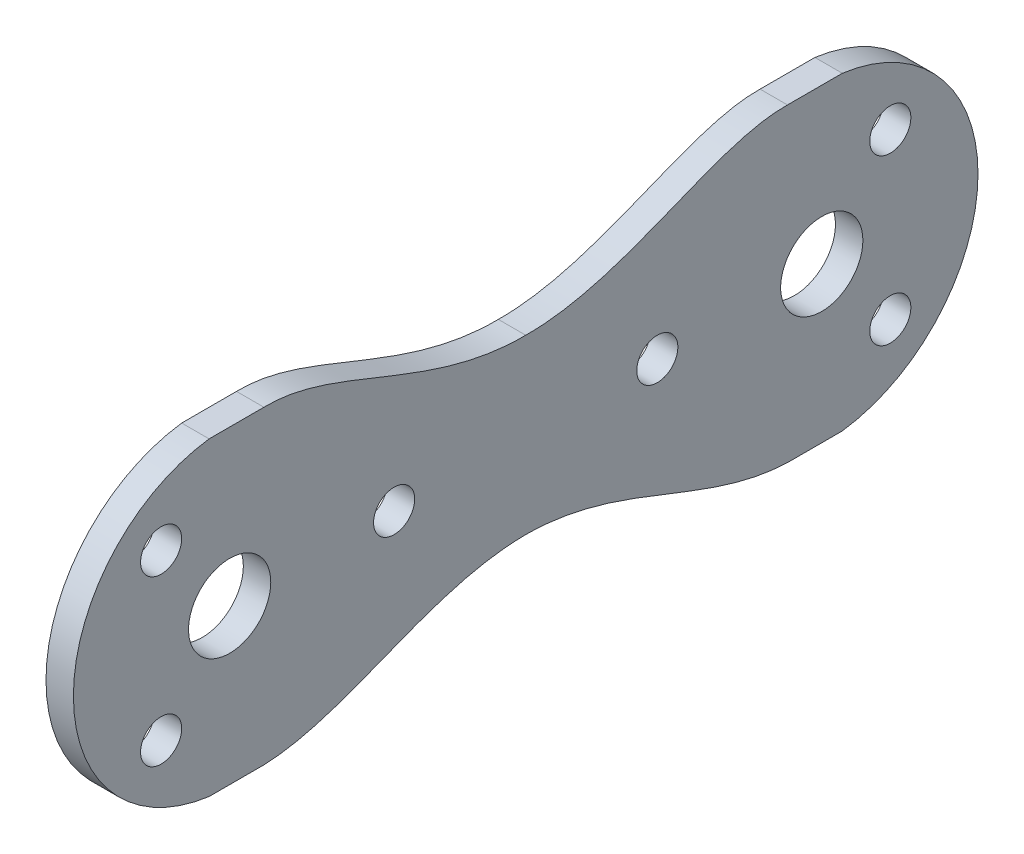
ISO-10303-21;
HEADER;
FILE_DESCRIPTION(('STEP AP214'),'2;1');
FILE_NAME('part.step','',(''),(''),'','','');
FILE_SCHEMA(('AUTOMOTIVE_DESIGN { 1 0 10303 214 1 1 1 1 }'));
ENDSEC;
DATA;
#1=APPLICATION_CONTEXT('core data for automotive mechanical design processes');
#2=APPLICATION_PROTOCOL_DEFINITION('international standard','automotive_design',2000,#1);
#3=PRODUCT_CONTEXT('',#1,'mechanical');
#4=PRODUCT('Part','Part','',(#3));
#5=PRODUCT_RELATED_PRODUCT_CATEGORY('part','',(#4));
#6=PRODUCT_DEFINITION_FORMATION('','',#4);
#7=PRODUCT_DEFINITION_CONTEXT('part definition',#1,'design');
#8=PRODUCT_DEFINITION('design','',#6,#7);
#9=PRODUCT_DEFINITION_SHAPE('','',#8);
#10=(LENGTH_UNIT() NAMED_UNIT(*) SI_UNIT(.MILLI.,.METRE.));
#11=(NAMED_UNIT(*) PLANE_ANGLE_UNIT() SI_UNIT($,.RADIAN.));
#12=(NAMED_UNIT(*) SI_UNIT($,.STERADIAN.) SOLID_ANGLE_UNIT());
#13=UNCERTAINTY_MEASURE_WITH_UNIT(LENGTH_MEASURE(1.E-05),#10,'distance_accuracy_value','');
#14=(GEOMETRIC_REPRESENTATION_CONTEXT(3) GLOBAL_UNCERTAINTY_ASSIGNED_CONTEXT((#13)) GLOBAL_UNIT_ASSIGNED_CONTEXT((#10,
#11,#12)) REPRESENTATION_CONTEXT('',''));
#15=CARTESIAN_POINT('',(0.,0.,0.));
#16=DIRECTION('',(0.,0.,1.));
#17=DIRECTION('',(1.,0.,0.));
#18=AXIS2_PLACEMENT_3D('',#15,#16,#17);
#19=CARTESIAN_POINT('',(2.,11.3,0.));
#20=DIRECTION('',(0.,-1.,0.));
#21=DIRECTION('',(0.,0.,-1.));
#22=AXIS2_PLACEMENT_3D('',#19,#20,#21);
#23=PLANE('',#22);
#24=DIRECTION('',(0.,0.,1.));
#25=VECTOR('',#24,1.);
#26=CARTESIAN_POINT('',(0.,11.3,0.));
#27=LINE('',#26,#25);
#28=CARTESIAN_POINT('',(0.,11.3,-1.49898989898991));
#29=VERTEX_POINT('',#28);
#30=CARTESIAN_POINT('',(0.,11.3,2.50101010101009));
#31=VERTEX_POINT('',#30);
#32=EDGE_CURVE('E205',#29,#31,#27,.T.);
#33=ORIENTED_EDGE('',*,*,#32,.T.);
#34=DIRECTION('',(-1.,0.,0.));
#35=VECTOR('',#34,1.);
#36=CARTESIAN_POINT('',(2.,11.3,2.50101010101009));
#37=LINE('',#36,#35);
#38=CARTESIAN_POINT('',(2.,11.3,2.50101010101009));
#39=VERTEX_POINT('',#38);
#40=EDGE_CURVE('E12',#39,#31,#37,.T.);
#41=ORIENTED_EDGE('',*,*,#40,.F.);
#42=DIRECTION('',(0.,0.,1.));
#43=VECTOR('',#42,1.);
#44=CARTESIAN_POINT('',(2.,11.3,0.));
#45=LINE('',#44,#43);
#46=CARTESIAN_POINT('',(2.,11.3,-1.49898989898991));
#47=VERTEX_POINT('',#46);
#48=EDGE_CURVE('E275',#47,#39,#45,.T.);
#49=ORIENTED_EDGE('',*,*,#48,.F.);
#50=DIRECTION('',(-1.,0.,0.));
#51=VECTOR('',#50,1.);
#52=CARTESIAN_POINT('',(2.,11.3,-1.49898989898991));
#53=LINE('',#52,#51);
#54=EDGE_CURVE('E55',#47,#29,#53,.T.);
#55=ORIENTED_EDGE('',*,*,#54,.T.);
#56=EDGE_LOOP('',(#33,#41,#49,#55));
#57=FACE_BOUND('',#56,.T.);
#58=ADVANCED_FACE('F39',(#57),#23,.F.);
#59=CARTESIAN_POINT('',(2.,11.3,2.50101010101009));
#60=CARTESIAN_POINT('',(2.,11.4296100531924,7.83989895120709));
#61=CARTESIAN_POINT('',(2.,6.2166526259407,14.3517891795841));
#62=CARTESIAN_POINT('',(2.,6.3,21.6010101010101));
#63=B_SPLINE_CURVE_WITH_KNOTS('',3,(#59,#60,#61,#62),.UNSPECIFIED.,.F.,.F.,(4,4),(0.,1.),.UNSPECIFIED.);
#64=DIRECTION('',(-1.,0.,0.));
#65=VECTOR('',#64,1.);
#66=SURFACE_OF_LINEAR_EXTRUSION('',#63,#65);
#67=CARTESIAN_POINT('',(0.,11.3,2.50101010101009));
#68=CARTESIAN_POINT('',(0.,11.4296100531924,7.83989895120709));
#69=CARTESIAN_POINT('',(0.,6.2166526259407,14.3517891795841));
#70=CARTESIAN_POINT('',(0.,6.3,21.6010101010101));
#71=B_SPLINE_CURVE_WITH_KNOTS('',3,(#67,#68,#69,#70),.UNSPECIFIED.,.F.,.F.,(4,4),(0.,1.),.UNSPECIFIED.);
#72=CARTESIAN_POINT('',(0.,6.3,21.6010101010101));
#73=VERTEX_POINT('',#72);
#74=EDGE_CURVE('E207',#31,#73,#71,.T.);
#75=ORIENTED_EDGE('',*,*,#74,.T.);
#76=DIRECTION('',(-1.,0.,0.));
#77=VECTOR('',#76,1.);
#78=CARTESIAN_POINT('',(2.,6.3,21.6010101010101));
#79=LINE('',#78,#77);
#80=CARTESIAN_POINT('',(2.,6.3,21.6010101010101));
#81=VERTEX_POINT('',#80);
#82=EDGE_CURVE('E47',#81,#73,#79,.T.);
#83=ORIENTED_EDGE('',*,*,#82,.F.);
#84=EDGE_CURVE('E100',#39,#81,#63,.T.);
#85=ORIENTED_EDGE('',*,*,#84,.F.);
#86=ORIENTED_EDGE('',*,*,#40,.T.);
#87=EDGE_LOOP('',(#75,#83,#85,#86));
#88=FACE_BOUND('',#87,.T.);
#89=ADVANCED_FACE('F292',(#88),#66,.F.);
#90=CARTESIAN_POINT('',(2.,11.3,40.7010101010101));
#91=CARTESIAN_POINT('',(2.,11.4296100531924,35.3621212508131));
#92=CARTESIAN_POINT('',(2.,6.2166526259407,28.8502310224361));
#93=CARTESIAN_POINT('',(2.,6.3,21.6010101010101));
#94=B_SPLINE_CURVE_WITH_KNOTS('',3,(#90,#91,#92,#93),.UNSPECIFIED.,.F.,.F.,(4,4),(0.,1.),.UNSPECIFIED.);
#95=DIRECTION('',(-1.,0.,0.));
#96=VECTOR('',#95,1.);
#97=SURFACE_OF_LINEAR_EXTRUSION('',#94,#96);
#98=CARTESIAN_POINT('',(0.,11.3,40.7010101010101));
#99=CARTESIAN_POINT('',(0.,11.4296100531924,35.3621212508131));
#100=CARTESIAN_POINT('',(0.,6.2166526259407,28.8502310224361));
#101=CARTESIAN_POINT('',(0.,6.3,21.6010101010101));
#102=B_SPLINE_CURVE_WITH_KNOTS('',3,(#98,#99,#100,#101),.UNSPECIFIED.,.F.,.F.,(4,4),(0.,1.),.UNSPECIFIED.);
#103=CARTESIAN_POINT('',(0.,11.3,40.7010101010101));
#104=VERTEX_POINT('',#103);
#105=EDGE_CURVE('E212',#104,#73,#102,.T.);
#106=ORIENTED_EDGE('',*,*,#105,.F.);
#107=DIRECTION('',(-1.,0.,0.));
#108=VECTOR('',#107,1.);
#109=CARTESIAN_POINT('',(2.,11.3,40.7010101010101));
#110=LINE('',#109,#108);
#111=CARTESIAN_POINT('',(2.,11.3,40.7010101010101));
#112=VERTEX_POINT('',#111);
#113=EDGE_CURVE('E285',#112,#104,#110,.T.);
#114=ORIENTED_EDGE('',*,*,#113,.F.);
#115=EDGE_CURVE('E291',#112,#81,#94,.T.);
#116=ORIENTED_EDGE('',*,*,#115,.T.);
#117=ORIENTED_EDGE('',*,*,#82,.T.);
#118=EDGE_LOOP('',(#106,#114,#116,#117));
#119=FACE_BOUND('',#118,.T.);
#120=ADVANCED_FACE('F289',(#119),#97,.T.);
#121=CARTESIAN_POINT('',(2.,11.3,0.));
#122=DIRECTION('',(0.,1.,0.));
#123=DIRECTION('',(0.,0.,1.));
#124=AXIS2_PLACEMENT_3D('',#121,#122,#123);
#125=PLANE('',#124);
#126=DIRECTION('',(0.,0.,-1.));
#127=VECTOR('',#126,1.);
#128=CARTESIAN_POINT('',(0.,11.3,0.));
#129=LINE('',#128,#127);
#130=CARTESIAN_POINT('',(0.,11.3,44.7010101010101));
#131=VERTEX_POINT('',#130);
#132=EDGE_CURVE('E220',#131,#104,#129,.T.);
#133=ORIENTED_EDGE('',*,*,#132,.F.);
#134=DIRECTION('',(-1.,0.,0.));
#135=VECTOR('',#134,1.);
#136=CARTESIAN_POINT('',(2.,11.3,44.7010101010101));
#137=LINE('',#136,#135);
#138=CARTESIAN_POINT('',(2.,11.3,44.7010101010101));
#139=VERTEX_POINT('',#138);
#140=EDGE_CURVE('E283',#139,#131,#137,.T.);
#141=ORIENTED_EDGE('',*,*,#140,.F.);
#142=DIRECTION('',(0.,0.,-1.));
#143=VECTOR('',#142,1.);
#144=CARTESIAN_POINT('',(2.,11.3,0.));
#145=LINE('',#144,#143);
#146=EDGE_CURVE('E304',#139,#112,#145,.T.);
#147=ORIENTED_EDGE('',*,*,#146,.T.);
#148=ORIENTED_EDGE('',*,*,#113,.T.);
#149=EDGE_LOOP('',(#133,#141,#147,#148));
#150=FACE_BOUND('',#149,.T.);
#151=ADVANCED_FACE('F300',(#150),#125,.T.);
#152=CARTESIAN_POINT('',(2.,0.,43.2020202020202));
#153=DIRECTION('',(-1.,0.,0.));
#154=DIRECTION('',(0.,0.,1.));
#155=AXIS2_PLACEMENT_3D('',#152,#153,#154);
#156=CYLINDRICAL_SURFACE('',#155,11.3989898989899);
#157=CARTESIAN_POINT('',(0.,0.,43.2020202020202));
#158=DIRECTION('',(1.,0.,0.));
#159=DIRECTION('',(0.,0.,-1.));
#160=AXIS2_PLACEMENT_3D('',#157,#158,#159);
#161=CIRCLE('',#160,11.3989898989899);
#162=CARTESIAN_POINT('',(0.,-11.3,44.7010101010101));
#163=VERTEX_POINT('',#162);
#164=EDGE_CURVE('E226',#131,#163,#161,.T.);
#165=ORIENTED_EDGE('',*,*,#164,.T.);
#166=DIRECTION('',(-1.,0.,0.));
#167=VECTOR('',#166,1.);
#168=CARTESIAN_POINT('',(2.,-11.3,44.7010101010101));
#169=LINE('',#168,#167);
#170=CARTESIAN_POINT('',(2.,-11.3,44.7010101010101));
#171=VERTEX_POINT('',#170);
#172=EDGE_CURVE('E281',#171,#163,#169,.T.);
#173=ORIENTED_EDGE('',*,*,#172,.F.);
#174=CARTESIAN_POINT('',(2.,0.,43.2020202020202));
#175=DIRECTION('',(1.,0.,0.));
#176=DIRECTION('',(0.,0.,-1.));
#177=AXIS2_PLACEMENT_3D('',#174,#175,#176);
#178=CIRCLE('',#177,11.3989898989899);
#179=EDGE_CURVE('E306',#139,#171,#178,.T.);
#180=ORIENTED_EDGE('',*,*,#179,.F.);
#181=ORIENTED_EDGE('',*,*,#140,.T.);
#182=EDGE_LOOP('',(#165,#173,#180,#181));
#183=FACE_BOUND('',#182,.T.);
#184=ADVANCED_FACE('F337',(#183),#156,.T.);
#185=CARTESIAN_POINT('',(2.,-11.3,0.));
#186=DIRECTION('',(0.,-1.,0.));
#187=DIRECTION('',(0.,0.,-1.));
#188=AXIS2_PLACEMENT_3D('',#185,#186,#187);
#189=PLANE('',#188);
#190=DIRECTION('',(0.,0.,1.));
#191=VECTOR('',#190,1.);
#192=CARTESIAN_POINT('',(0.,-11.3,0.));
#193=LINE('',#192,#191);
#194=CARTESIAN_POINT('',(0.,-11.3,40.7010101010101));
#195=VERTEX_POINT('',#194);
#196=EDGE_CURVE('E229',#195,#163,#193,.T.);
#197=ORIENTED_EDGE('',*,*,#196,.F.);
#198=DIRECTION('',(-1.,0.,0.));
#199=VECTOR('',#198,1.);
#200=CARTESIAN_POINT('',(2.,-11.3,40.7010101010101));
#201=LINE('',#200,#199);
#202=CARTESIAN_POINT('',(2.,-11.3,40.7010101010101));
#203=VERTEX_POINT('',#202);
#204=EDGE_CURVE('E279',#203,#195,#201,.T.);
#205=ORIENTED_EDGE('',*,*,#204,.F.);
#206=DIRECTION('',(0.,0.,1.));
#207=VECTOR('',#206,1.);
#208=CARTESIAN_POINT('',(2.,-11.3,0.));
#209=LINE('',#208,#207);
#210=EDGE_CURVE('E146',#203,#171,#209,.T.);
#211=ORIENTED_EDGE('',*,*,#210,.T.);
#212=ORIENTED_EDGE('',*,*,#172,.T.);
#213=EDGE_LOOP('',(#197,#205,#211,#212));
#214=FACE_BOUND('',#213,.T.);
#215=ADVANCED_FACE('F334',(#214),#189,.T.);
#216=CARTESIAN_POINT('',(2.,-11.3,40.7010101010101));
#217=CARTESIAN_POINT('',(2.,-11.0635846151513,34.4557796350953));
#218=CARTESIAN_POINT('',(2.,-6.33994929020768,28.7693606156067));
#219=CARTESIAN_POINT('',(2.,-6.29999999999999,21.6010101010101));
#220=B_SPLINE_CURVE_WITH_KNOTS('',3,(#216,#217,#218,#219),.UNSPECIFIED.,.F.,.F.,(4,4),(0.,1.),.UNSPECIFIED.);
#221=DIRECTION('',(-1.,0.,0.));
#222=VECTOR('',#221,1.);
#223=SURFACE_OF_LINEAR_EXTRUSION('',#220,#222);
#224=CARTESIAN_POINT('',(0.,-11.3,40.7010101010101));
#225=CARTESIAN_POINT('',(0.,-11.0635846151513,34.4557796350953));
#226=CARTESIAN_POINT('',(0.,-6.33994929020768,28.7693606156067));
#227=CARTESIAN_POINT('',(0.,-6.29999999999999,21.6010101010101));
#228=B_SPLINE_CURVE_WITH_KNOTS('',3,(#224,#225,#226,#227),.UNSPECIFIED.,.F.,.F.,(4,4),(0.,1.),.UNSPECIFIED.);
#229=CARTESIAN_POINT('',(0.,-6.29999999999999,21.6010101010101));
#230=VERTEX_POINT('',#229);
#231=EDGE_CURVE('E232',#195,#230,#228,.T.);
#232=ORIENTED_EDGE('',*,*,#231,.T.);
#233=DIRECTION('',(-1.,0.,0.));
#234=VECTOR('',#233,1.);
#235=CARTESIAN_POINT('',(2.,-6.29999999999999,21.6010101010101));
#236=LINE('',#235,#234);
#237=CARTESIAN_POINT('',(2.,-6.29999999999999,21.6010101010101));
#238=VERTEX_POINT('',#237);
#239=EDGE_CURVE('E131',#238,#230,#236,.T.);
#240=ORIENTED_EDGE('',*,*,#239,.F.);
#241=EDGE_CURVE('E143',#203,#238,#220,.T.);
#242=ORIENTED_EDGE('',*,*,#241,.F.);
#243=ORIENTED_EDGE('',*,*,#204,.T.);
#244=EDGE_LOOP('',(#232,#240,#242,#243));
#245=FACE_BOUND('',#244,.T.);
#246=ADVANCED_FACE('F340',(#245),#223,.F.);
#247=CARTESIAN_POINT('',(2.,-11.3,2.50101010101009));
#248=CARTESIAN_POINT('',(2.,-11.0635846151513,8.74624056692493));
#249=CARTESIAN_POINT('',(2.,-6.33994929020768,14.4326595864136));
#250=CARTESIAN_POINT('',(2.,-6.29999999999999,21.6010101010101));
#251=B_SPLINE_CURVE_WITH_KNOTS('',3,(#247,#248,#249,#250),.UNSPECIFIED.,.F.,.F.,(4,4),(0.,1.),.UNSPECIFIED.);
#252=DIRECTION('',(-1.,0.,0.));
#253=VECTOR('',#252,1.);
#254=SURFACE_OF_LINEAR_EXTRUSION('',#251,#253);
#255=CARTESIAN_POINT('',(0.,-11.3,2.50101010101009));
#256=CARTESIAN_POINT('',(0.,-11.0635846151513,8.74624056692493));
#257=CARTESIAN_POINT('',(0.,-6.33994929020768,14.4326595864136));
#258=CARTESIAN_POINT('',(0.,-6.29999999999999,21.6010101010101));
#259=B_SPLINE_CURVE_WITH_KNOTS('',3,(#255,#256,#257,#258),.UNSPECIFIED.,.F.,.F.,(4,4),(0.,1.),.UNSPECIFIED.);
#260=CARTESIAN_POINT('',(0.,-11.3,2.50101010101009));
#261=VERTEX_POINT('',#260);
#262=EDGE_CURVE('E128',#261,#230,#259,.T.);
#263=ORIENTED_EDGE('',*,*,#262,.F.);
#264=DIRECTION('',(-1.,0.,0.));
#265=VECTOR('',#264,1.);
#266=CARTESIAN_POINT('',(2.,-11.3,2.50101010101009));
#267=LINE('',#266,#265);
#268=CARTESIAN_POINT('',(2.,-11.3,2.50101010101009));
#269=VERTEX_POINT('',#268);
#270=EDGE_CURVE('E122',#269,#261,#267,.T.);
#271=ORIENTED_EDGE('',*,*,#270,.F.);
#272=EDGE_CURVE('E126',#269,#238,#251,.T.);
#273=ORIENTED_EDGE('',*,*,#272,.T.);
#274=ORIENTED_EDGE('',*,*,#239,.T.);
#275=EDGE_LOOP('',(#263,#271,#273,#274));
#276=FACE_BOUND('',#275,.T.);
#277=ADVANCED_FACE('F124',(#276),#254,.T.);
#278=CARTESIAN_POINT('',(2.,-11.3,0.));
#279=DIRECTION('',(0.,1.,0.));
#280=DIRECTION('',(0.,0.,1.));
#281=AXIS2_PLACEMENT_3D('',#278,#279,#280);
#282=PLANE('',#281);
#283=DIRECTION('',(0.,0.,-1.));
#284=VECTOR('',#283,1.);
#285=CARTESIAN_POINT('',(0.,-11.3,0.));
#286=LINE('',#285,#284);
#287=CARTESIAN_POINT('',(0.,-11.3,-1.49898989898991));
#288=VERTEX_POINT('',#287);
#289=EDGE_CURVE('E243',#261,#288,#286,.T.);
#290=ORIENTED_EDGE('',*,*,#289,.T.);
#291=DIRECTION('',(-1.,0.,0.));
#292=VECTOR('',#291,1.);
#293=CARTESIAN_POINT('',(2.,-11.3,-1.49898989898991));
#294=LINE('',#293,#292);
#295=CARTESIAN_POINT('',(2.,-11.3,-1.49898989898991));
#296=VERTEX_POINT('',#295);
#297=EDGE_CURVE('E88',#296,#288,#294,.T.);
#298=ORIENTED_EDGE('',*,*,#297,.F.);
#299=DIRECTION('',(0.,0.,-1.));
#300=VECTOR('',#299,1.);
#301=CARTESIAN_POINT('',(2.,-11.3,0.));
#302=LINE('',#301,#300);
#303=EDGE_CURVE('E133',#269,#296,#302,.T.);
#304=ORIENTED_EDGE('',*,*,#303,.F.);
#305=ORIENTED_EDGE('',*,*,#270,.T.);
#306=EDGE_LOOP('',(#290,#298,#304,#305));
#307=FACE_BOUND('',#306,.T.);
#308=ADVANCED_FACE('F134',(#307),#282,.F.);
#309=CARTESIAN_POINT('',(2.,-6.,-5.));
#310=DIRECTION('',(-1.,0.,0.));
#311=DIRECTION('',(0.,0.,1.));
#312=AXIS2_PLACEMENT_3D('',#309,#310,#311);
#313=CYLINDRICAL_SURFACE('',#312,1.5);
#314=CARTESIAN_POINT('',(2.,-6.,-5.));
#315=DIRECTION('',(1.,0.,0.));
#316=DIRECTION('',(0.,0.,-1.));
#317=AXIS2_PLACEMENT_3D('',#314,#315,#316);
#318=CIRCLE('',#317,1.5);
#319=CARTESIAN_POINT('',(2.,-6.,-6.5));
#320=VERTEX_POINT('',#319);
#321=EDGE_CURVE('E198',#320,#320,#318,.T.);
#322=ORIENTED_EDGE('',*,*,#321,.T.);
#323=EDGE_LOOP('',(#322));
#324=FACE_BOUND('',#323,.T.);
#325=CARTESIAN_POINT('',(0.,-6.,-5.));
#326=DIRECTION('',(1.,0.,0.));
#327=DIRECTION('',(0.,0.,-1.));
#328=AXIS2_PLACEMENT_3D('',#325,#326,#327);
#329=CIRCLE('',#328,1.5);
#330=CARTESIAN_POINT('',(0.,-6.,-6.5));
#331=VERTEX_POINT('',#330);
#332=EDGE_CURVE('E269',#331,#331,#329,.T.);
#333=ORIENTED_EDGE('',*,*,#332,.F.);
#334=EDGE_LOOP('',(#333));
#335=FACE_BOUND('',#334,.T.);
#336=ADVANCED_FACE('F367',(#324,#335),#313,.F.);
#337=CARTESIAN_POINT('',(2.,0.,0.));
#338=DIRECTION('',(-1.,0.,0.));
#339=DIRECTION('',(0.,0.,1.));
#340=AXIS2_PLACEMENT_3D('',#337,#338,#339);
#341=CYLINDRICAL_SURFACE('',#340,3.);
#342=CARTESIAN_POINT('',(2.,0.,0.));
#343=DIRECTION('',(1.,0.,0.));
#344=DIRECTION('',(0.,0.,-1.));
#345=AXIS2_PLACEMENT_3D('',#342,#343,#344);
#346=CIRCLE('',#345,3.);
#347=CARTESIAN_POINT('',(2.,0.,-3.));
#348=VERTEX_POINT('',#347);
#349=EDGE_CURVE('E194',#348,#348,#346,.T.);
#350=ORIENTED_EDGE('',*,*,#349,.T.);
#351=EDGE_LOOP('',(#350));
#352=FACE_BOUND('',#351,.T.);
#353=CARTESIAN_POINT('',(0.,0.,0.));
#354=DIRECTION('',(1.,0.,0.));
#355=DIRECTION('',(0.,0.,-1.));
#356=AXIS2_PLACEMENT_3D('',#353,#354,#355);
#357=CIRCLE('',#356,3.);
#358=CARTESIAN_POINT('',(0.,0.,-3.));
#359=VERTEX_POINT('',#358);
#360=EDGE_CURVE('E266',#359,#359,#357,.T.);
#361=ORIENTED_EDGE('',*,*,#360,.F.);
#362=EDGE_LOOP('',(#361));
#363=FACE_BOUND('',#362,.T.);
#364=ADVANCED_FACE('F371',(#352,#363),#341,.F.);
#365=CARTESIAN_POINT('',(2.,0.,12.));
#366=DIRECTION('',(-1.,0.,0.));
#367=DIRECTION('',(0.,0.,1.));
#368=AXIS2_PLACEMENT_3D('',#365,#366,#367);
#369=CYLINDRICAL_SURFACE('',#368,1.5);
#370=CARTESIAN_POINT('',(2.,0.,12.));
#371=DIRECTION('',(1.,0.,0.));
#372=DIRECTION('',(0.,0.,-1.));
#373=AXIS2_PLACEMENT_3D('',#370,#371,#372);
#374=CIRCLE('',#373,1.5);
#375=CARTESIAN_POINT('',(2.,0.,10.5));
#376=VERTEX_POINT('',#375);
#377=EDGE_CURVE('E191',#376,#376,#374,.T.);
#378=ORIENTED_EDGE('',*,*,#377,.T.);
#379=EDGE_LOOP('',(#378));
#380=FACE_BOUND('',#379,.T.);
#381=CARTESIAN_POINT('',(0.,0.,12.));
#382=DIRECTION('',(1.,0.,0.));
#383=DIRECTION('',(0.,0.,-1.));
#384=AXIS2_PLACEMENT_3D('',#381,#382,#383);
#385=CIRCLE('',#384,1.5);
#386=CARTESIAN_POINT('',(0.,0.,10.5));
#387=VERTEX_POINT('',#386);
#388=EDGE_CURVE('E263',#387,#387,#385,.T.);
#389=ORIENTED_EDGE('',*,*,#388,.F.);
#390=EDGE_LOOP('',(#389));
#391=FACE_BOUND('',#390,.T.);
#392=ADVANCED_FACE('F377',(#380,#391),#369,.F.);
#393=CARTESIAN_POINT('',(2.,6.,48.2020202020202));
#394=DIRECTION('',(-1.,0.,0.));
#395=DIRECTION('',(0.,0.,1.));
#396=AXIS2_PLACEMENT_3D('',#393,#394,#395);
#397=CYLINDRICAL_SURFACE('',#396,1.5);
#398=CARTESIAN_POINT('',(2.,6.,48.2020202020202));
#399=DIRECTION('',(1.,0.,0.));
#400=DIRECTION('',(0.,0.,-1.));
#401=AXIS2_PLACEMENT_3D('',#398,#399,#400);
#402=CIRCLE('',#401,1.5);
#403=CARTESIAN_POINT('',(2.,6.,46.7020202020202));
#404=VERTEX_POINT('',#403);
#405=EDGE_CURVE('E184',#404,#404,#402,.T.);
#406=ORIENTED_EDGE('',*,*,#405,.T.);
#407=EDGE_LOOP('',(#406));
#408=FACE_BOUND('',#407,.T.);
#409=CARTESIAN_POINT('',(0.,6.,48.2020202020202));
#410=DIRECTION('',(1.,0.,0.));
#411=DIRECTION('',(0.,0.,-1.));
#412=AXIS2_PLACEMENT_3D('',#409,#410,#411);
#413=CIRCLE('',#412,1.5);
#414=CARTESIAN_POINT('',(0.,6.,46.7020202020202));
#415=VERTEX_POINT('',#414);
#416=EDGE_CURVE('E260',#415,#415,#413,.T.);
#417=ORIENTED_EDGE('',*,*,#416,.F.);
#418=EDGE_LOOP('',(#417));
#419=FACE_BOUND('',#418,.T.);
#420=ADVANCED_FACE('F385',(#408,#419),#397,.F.);
#421=CARTESIAN_POINT('',(2.,-6.,48.2020202020202));
#422=DIRECTION('',(-1.,0.,0.));
#423=DIRECTION('',(0.,0.,1.));
#424=AXIS2_PLACEMENT_3D('',#421,#422,#423);
#425=CYLINDRICAL_SURFACE('',#424,1.5);
#426=CARTESIAN_POINT('',(2.,-6.,48.2020202020202));
#427=DIRECTION('',(1.,0.,0.));
#428=DIRECTION('',(0.,0.,-1.));
#429=AXIS2_PLACEMENT_3D('',#426,#427,#428);
#430=CIRCLE('',#429,1.5);
#431=CARTESIAN_POINT('',(2.,-6.,46.7020202020202));
#432=VERTEX_POINT('',#431);
#433=EDGE_CURVE('E180',#432,#432,#430,.T.);
#434=ORIENTED_EDGE('',*,*,#433,.T.);
#435=EDGE_LOOP('',(#434));
#436=FACE_BOUND('',#435,.T.);
#437=CARTESIAN_POINT('',(0.,-6.,48.2020202020202));
#438=DIRECTION('',(1.,0.,0.));
#439=DIRECTION('',(0.,0.,-1.));
#440=AXIS2_PLACEMENT_3D('',#437,#438,#439);
#441=CIRCLE('',#440,1.5);
#442=CARTESIAN_POINT('',(0.,-6.,46.7020202020202));
#443=VERTEX_POINT('',#442);
#444=EDGE_CURVE('E257',#443,#443,#441,.T.);
#445=ORIENTED_EDGE('',*,*,#444,.F.);
#446=EDGE_LOOP('',(#445));
#447=FACE_BOUND('',#446,.T.);
#448=ADVANCED_FACE('F389',(#436,#447),#425,.F.);
#449=CARTESIAN_POINT('',(2.,0.,43.2020202020202));
#450=DIRECTION('',(-1.,0.,0.));
#451=DIRECTION('',(0.,0.,1.));
#452=AXIS2_PLACEMENT_3D('',#449,#450,#451);
#453=CYLINDRICAL_SURFACE('',#452,3.);
#454=CARTESIAN_POINT('',(2.,0.,43.2020202020202));
#455=DIRECTION('',(1.,0.,0.));
#456=DIRECTION('',(0.,0.,-1.));
#457=AXIS2_PLACEMENT_3D('',#454,#455,#456);
#458=CIRCLE('',#457,3.);
#459=CARTESIAN_POINT('',(2.,0.,40.2020202020202));
#460=VERTEX_POINT('',#459);
#461=EDGE_CURVE('E176',#460,#460,#458,.T.);
#462=ORIENTED_EDGE('',*,*,#461,.T.);
#463=EDGE_LOOP('',(#462));
#464=FACE_BOUND('',#463,.T.);
#465=CARTESIAN_POINT('',(0.,0.,43.2020202020202));
#466=DIRECTION('',(1.,0.,0.));
#467=DIRECTION('',(0.,0.,-1.));
#468=AXIS2_PLACEMENT_3D('',#465,#466,#467);
#469=CIRCLE('',#468,3.);
#470=CARTESIAN_POINT('',(0.,0.,40.2020202020202));
#471=VERTEX_POINT('',#470);
#472=EDGE_CURVE('E254',#471,#471,#469,.T.);
#473=ORIENTED_EDGE('',*,*,#472,.F.);
#474=EDGE_LOOP('',(#473));
#475=FACE_BOUND('',#474,.T.);
#476=ADVANCED_FACE('F362',(#464,#475),#453,.F.);
#477=CARTESIAN_POINT('',(2.,0.,31.2020202020202));
#478=DIRECTION('',(-1.,0.,0.));
#479=DIRECTION('',(0.,0.,1.));
#480=AXIS2_PLACEMENT_3D('',#477,#478,#479);
#481=CYLINDRICAL_SURFACE('',#480,1.5);
#482=CARTESIAN_POINT('',(2.,0.,31.2020202020202));
#483=DIRECTION('',(1.,0.,0.));
#484=DIRECTION('',(0.,0.,-1.));
#485=AXIS2_PLACEMENT_3D('',#482,#483,#484);
#486=CIRCLE('',#485,1.5);
#487=CARTESIAN_POINT('',(2.,0.,29.7020202020202));
#488=VERTEX_POINT('',#487);
#489=EDGE_CURVE('E173',#488,#488,#486,.T.);
#490=ORIENTED_EDGE('',*,*,#489,.T.);
#491=EDGE_LOOP('',(#490));
#492=FACE_BOUND('',#491,.T.);
#493=CARTESIAN_POINT('',(0.,0.,31.2020202020202));
#494=DIRECTION('',(1.,0.,0.));
#495=DIRECTION('',(0.,0.,-1.));
#496=AXIS2_PLACEMENT_3D('',#493,#494,#495);
#497=CIRCLE('',#496,1.5);
#498=CARTESIAN_POINT('',(0.,0.,29.7020202020202));
#499=VERTEX_POINT('',#498);
#500=EDGE_CURVE('E251',#499,#499,#497,.T.);
#501=ORIENTED_EDGE('',*,*,#500,.F.);
#502=EDGE_LOOP('',(#501));
#503=FACE_BOUND('',#502,.T.);
#504=ADVANCED_FACE('F354',(#492,#503),#481,.F.);
#505=CARTESIAN_POINT('',(2.,0.,0.));
#506=DIRECTION('',(-1.,0.,0.));
#507=DIRECTION('',(0.,0.,1.));
#508=AXIS2_PLACEMENT_3D('',#505,#506,#507);
#509=CYLINDRICAL_SURFACE('',#508,11.3989898989899);
#510=CARTESIAN_POINT('',(0.,0.,0.));
#511=DIRECTION('',(1.,0.,0.));
#512=DIRECTION('',(0.,0.,-1.));
#513=AXIS2_PLACEMENT_3D('',#510,#511,#512);
#514=CIRCLE('',#513,11.3989898989899);
#515=EDGE_CURVE('E248',#29,#288,#514,.F.);
#516=ORIENTED_EDGE('',*,*,#515,.F.);
#517=ORIENTED_EDGE('',*,*,#54,.F.);
#518=CARTESIAN_POINT('',(2.,0.,0.));
#519=DIRECTION('',(1.,0.,0.));
#520=DIRECTION('',(0.,0.,-1.));
#521=AXIS2_PLACEMENT_3D('',#518,#519,#520);
#522=CIRCLE('',#521,11.3989898989899);
#523=EDGE_CURVE('E137',#47,#296,#522,.F.);
#524=ORIENTED_EDGE('',*,*,#523,.T.);
#525=ORIENTED_EDGE('',*,*,#297,.T.);
#526=EDGE_LOOP('',(#516,#517,#524,#525));
#527=FACE_BOUND('',#526,.T.);
#528=ADVANCED_FACE('F351',(#527),#509,.T.);
#529=CARTESIAN_POINT('',(2.,6.,-5.));
#530=DIRECTION('',(-1.,0.,0.));
#531=DIRECTION('',(0.,0.,1.));
#532=AXIS2_PLACEMENT_3D('',#529,#530,#531);
#533=CYLINDRICAL_SURFACE('',#532,1.5);
#534=CARTESIAN_POINT('',(2.,6.,-5.));
#535=DIRECTION('',(1.,0.,0.));
#536=DIRECTION('',(0.,0.,-1.));
#537=AXIS2_PLACEMENT_3D('',#534,#535,#536);
#538=CIRCLE('',#537,1.5);
#539=CARTESIAN_POINT('',(2.,6.,-6.5));
#540=VERTEX_POINT('',#539);
#541=EDGE_CURVE('E201',#540,#540,#538,.T.);
#542=ORIENTED_EDGE('',*,*,#541,.T.);
#543=EDGE_LOOP('',(#542));
#544=FACE_BOUND('',#543,.T.);
#545=CARTESIAN_POINT('',(0.,6.,-5.));
#546=DIRECTION('',(1.,0.,0.));
#547=DIRECTION('',(0.,0.,-1.));
#548=AXIS2_PLACEMENT_3D('',#545,#546,#547);
#549=CIRCLE('',#548,1.5);
#550=CARTESIAN_POINT('',(0.,6.,-6.5));
#551=VERTEX_POINT('',#550);
#552=EDGE_CURVE('E272',#551,#551,#549,.T.);
#553=ORIENTED_EDGE('',*,*,#552,.F.);
#554=EDGE_LOOP('',(#553));
#555=FACE_BOUND('',#554,.T.);
#556=ADVANCED_FACE('F353',(#544,#555),#533,.F.);
#557=CARTESIAN_POINT('',(2.,0.,0.));
#558=DIRECTION('',(1.,0.,0.));
#559=DIRECTION('',(0.,0.,-1.));
#560=AXIS2_PLACEMENT_3D('',#557,#558,#559);
#561=PLANE('',#560);
#562=ORIENTED_EDGE('',*,*,#48,.T.);
#563=ORIENTED_EDGE('',*,*,#84,.T.);
#564=ORIENTED_EDGE('',*,*,#115,.F.);
#565=ORIENTED_EDGE('',*,*,#146,.F.);
#566=ORIENTED_EDGE('',*,*,#179,.T.);
#567=ORIENTED_EDGE('',*,*,#210,.F.);
#568=ORIENTED_EDGE('',*,*,#241,.T.);
#569=ORIENTED_EDGE('',*,*,#272,.F.);
#570=ORIENTED_EDGE('',*,*,#303,.T.);
#571=ORIENTED_EDGE('',*,*,#523,.F.);
#572=EDGE_LOOP('',(#562,#563,#564,#565,#566,#567,#568,#569,#570,#571));
#573=FACE_BOUND('',#572,.T.);
#574=ORIENTED_EDGE('',*,*,#489,.F.);
#575=EDGE_LOOP('',(#574));
#576=FACE_BOUND('',#575,.T.);
#577=ORIENTED_EDGE('',*,*,#461,.F.);
#578=EDGE_LOOP('',(#577));
#579=FACE_BOUND('',#578,.T.);
#580=ORIENTED_EDGE('',*,*,#433,.F.);
#581=EDGE_LOOP('',(#580));
#582=FACE_BOUND('',#581,.T.);
#583=ORIENTED_EDGE('',*,*,#405,.F.);
#584=EDGE_LOOP('',(#583));
#585=FACE_BOUND('',#584,.T.);
#586=ORIENTED_EDGE('',*,*,#377,.F.);
#587=EDGE_LOOP('',(#586));
#588=FACE_BOUND('',#587,.T.);
#589=ORIENTED_EDGE('',*,*,#349,.F.);
#590=EDGE_LOOP('',(#589));
#591=FACE_BOUND('',#590,.T.);
#592=ORIENTED_EDGE('',*,*,#321,.F.);
#593=EDGE_LOOP('',(#592));
#594=FACE_BOUND('',#593,.T.);
#595=ORIENTED_EDGE('',*,*,#541,.F.);
#596=EDGE_LOOP('',(#595));
#597=FACE_BOUND('',#596,.T.);
#598=ADVANCED_FACE('F139',(#573,#576,#579,#582,#585,#588,#591,#594,#597),#561,.T.);
#599=CARTESIAN_POINT('',(0.,0.,0.));
#600=DIRECTION('',(1.,0.,0.));
#601=DIRECTION('',(0.,0.,-1.));
#602=AXIS2_PLACEMENT_3D('',#599,#600,#601);
#603=PLANE('',#602);
#604=ORIENTED_EDGE('',*,*,#32,.F.);
#605=ORIENTED_EDGE('',*,*,#515,.T.);
#606=ORIENTED_EDGE('',*,*,#289,.F.);
#607=ORIENTED_EDGE('',*,*,#262,.T.);
#608=ORIENTED_EDGE('',*,*,#231,.F.);
#609=ORIENTED_EDGE('',*,*,#196,.T.);
#610=ORIENTED_EDGE('',*,*,#164,.F.);
#611=ORIENTED_EDGE('',*,*,#132,.T.);
#612=ORIENTED_EDGE('',*,*,#105,.T.);
#613=ORIENTED_EDGE('',*,*,#74,.F.);
#614=EDGE_LOOP('',(#604,#605,#606,#607,#608,#609,#610,#611,#612,#613));
#615=FACE_BOUND('',#614,.T.);
#616=ORIENTED_EDGE('',*,*,#500,.T.);
#617=EDGE_LOOP('',(#616));
#618=FACE_BOUND('',#617,.T.);
#619=ORIENTED_EDGE('',*,*,#472,.T.);
#620=EDGE_LOOP('',(#619));
#621=FACE_BOUND('',#620,.T.);
#622=ORIENTED_EDGE('',*,*,#444,.T.);
#623=EDGE_LOOP('',(#622));
#624=FACE_BOUND('',#623,.T.);
#625=ORIENTED_EDGE('',*,*,#416,.T.);
#626=EDGE_LOOP('',(#625));
#627=FACE_BOUND('',#626,.T.);
#628=ORIENTED_EDGE('',*,*,#388,.T.);
#629=EDGE_LOOP('',(#628));
#630=FACE_BOUND('',#629,.T.);
#631=ORIENTED_EDGE('',*,*,#360,.T.);
#632=EDGE_LOOP('',(#631));
#633=FACE_BOUND('',#632,.T.);
#634=ORIENTED_EDGE('',*,*,#332,.T.);
#635=EDGE_LOOP('',(#634));
#636=FACE_BOUND('',#635,.T.);
#637=ORIENTED_EDGE('',*,*,#552,.T.);
#638=EDGE_LOOP('',(#637));
#639=FACE_BOUND('',#638,.T.);
#640=ADVANCED_FACE('F295',(#615,#618,#621,#624,#627,#630,#633,#636,#639),#603,.F.);
#641=CLOSED_SHELL('',(#58,#89,#120,#151,#184,#215,#246,#277,#308,#336,#364,#392,#420,#448,#476,
#504,#528,#556,#598,#640));
#642=MANIFOLD_SOLID_BREP('B2',#641);
#643=ADVANCED_BREP_SHAPE_REPRESENTATION('',(#18,#642),#14);
#644=SHAPE_DEFINITION_REPRESENTATION(#9,#643);
ENDSEC;
END-ISO-10303-21;
